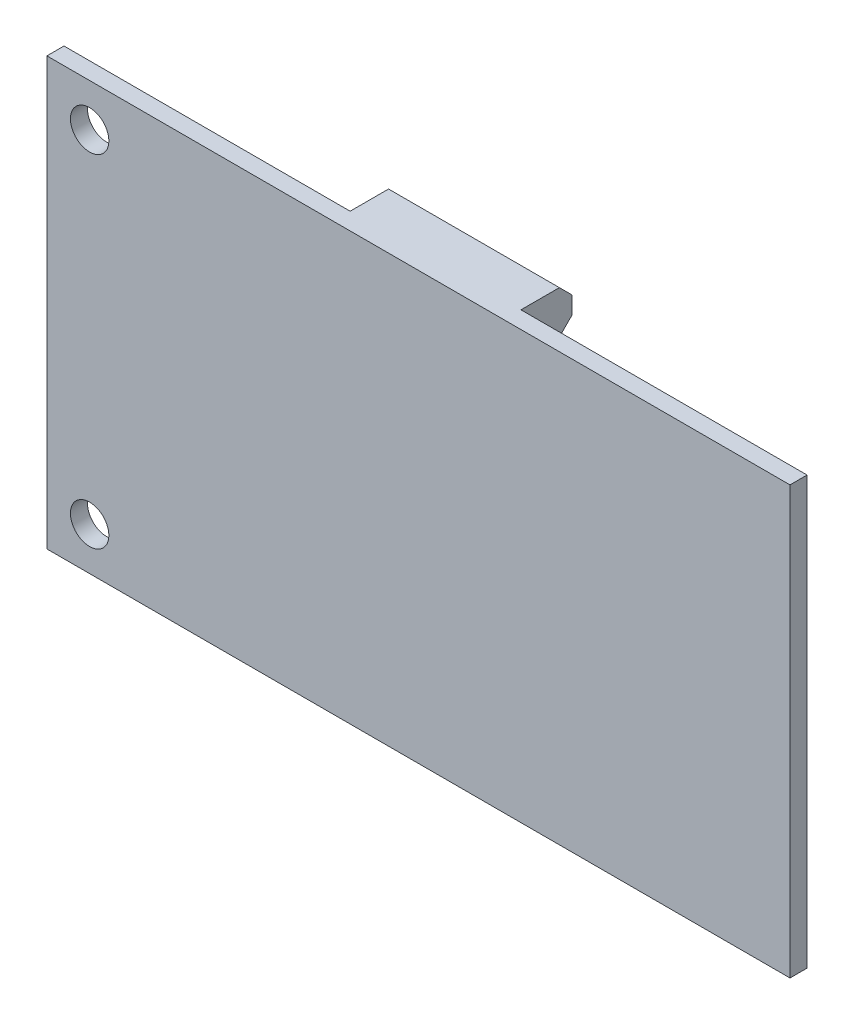
ISO-10303-21;
HEADER;
FILE_DESCRIPTION(('STEP AP214'),'2;1');
FILE_NAME('part.step','',(''),(''),'','','');
FILE_SCHEMA(('AUTOMOTIVE_DESIGN { 1 0 10303 214 1 1 1 1 }'));
ENDSEC;
DATA;
#1=APPLICATION_CONTEXT('core data for automotive mechanical design processes');
#2=APPLICATION_PROTOCOL_DEFINITION('international standard','automotive_design',2000,#1);
#3=PRODUCT_CONTEXT('',#1,'mechanical');
#4=PRODUCT('Part','Part','',(#3));
#5=PRODUCT_RELATED_PRODUCT_CATEGORY('part','',(#4));
#6=PRODUCT_DEFINITION_FORMATION('','',#4);
#7=PRODUCT_DEFINITION_CONTEXT('part definition',#1,'design');
#8=PRODUCT_DEFINITION('design','',#6,#7);
#9=PRODUCT_DEFINITION_SHAPE('','',#8);
#10=(LENGTH_UNIT() NAMED_UNIT(*) SI_UNIT(.MILLI.,.METRE.));
#11=(NAMED_UNIT(*) PLANE_ANGLE_UNIT() SI_UNIT($,.RADIAN.));
#12=(NAMED_UNIT(*) SI_UNIT($,.STERADIAN.) SOLID_ANGLE_UNIT());
#13=UNCERTAINTY_MEASURE_WITH_UNIT(LENGTH_MEASURE(1.E-05),#10,'distance_accuracy_value','');
#14=(GEOMETRIC_REPRESENTATION_CONTEXT(3) GLOBAL_UNCERTAINTY_ASSIGNED_CONTEXT((#13)) GLOBAL_UNIT_ASSIGNED_CONTEXT((#10,
#11,#12)) REPRESENTATION_CONTEXT('',''));
#15=CARTESIAN_POINT('',(0.,0.,0.));
#16=DIRECTION('',(0.,0.,1.));
#17=DIRECTION('',(1.,0.,0.));
#18=AXIS2_PLACEMENT_3D('',#15,#16,#17);
#19=CARTESIAN_POINT('',(0.,0.,0.));
#20=DIRECTION('',(0.,0.,1.));
#21=DIRECTION('',(1.,0.,0.));
#22=AXIS2_PLACEMENT_3D('',#19,#20,#21);
#23=PLANE('',#22);
#24=CARTESIAN_POINT('',(-38.5,20.,0.));
#25=DIRECTION('',(0.,0.,-1.));
#26=DIRECTION('',(-1.,0.,0.));
#27=AXIS2_PLACEMENT_3D('',#24,#25,#26);
#28=CIRCLE('',#27,2.25);
#29=CARTESIAN_POINT('',(-40.75,20.,0.));
#30=VERTEX_POINT('',#29);
#31=EDGE_CURVE('E425',#30,#30,#28,.T.);
#32=ORIENTED_EDGE('',*,*,#31,.F.);
#33=EDGE_LOOP('',(#32));
#34=FACE_BOUND('',#33,.T.);
#35=DIRECTION('',(0.,-1.,0.));
#36=VECTOR('',#35,1.);
#37=CARTESIAN_POINT('',(23.5,-25.,0.));
#38=LINE('',#37,#36);
#39=CARTESIAN_POINT('',(23.5,-22.5,0.));
#40=VERTEX_POINT('',#39);
#41=CARTESIAN_POINT('',(23.5,-25.,0.));
#42=VERTEX_POINT('',#41);
#43=EDGE_CURVE('E50',#40,#42,#38,.T.);
#44=ORIENTED_EDGE('',*,*,#43,.F.);
#45=DIRECTION('',(1.,0.,0.));
#46=VECTOR('',#45,1.);
#47=CARTESIAN_POINT('',(23.5,-22.5,0.));
#48=LINE('',#47,#46);
#49=CARTESIAN_POINT('',(16.5,-22.5,0.));
#50=VERTEX_POINT('',#49);
#51=EDGE_CURVE('E191',#50,#40,#48,.T.);
#52=ORIENTED_EDGE('',*,*,#51,.F.);
#53=DIRECTION('',(0.,1.,0.));
#54=VECTOR('',#53,1.);
#55=CARTESIAN_POINT('',(16.5,-25.,0.));
#56=LINE('',#55,#54);
#57=CARTESIAN_POINT('',(16.5,-25.,0.));
#58=VERTEX_POINT('',#57);
#59=EDGE_CURVE('E427',#58,#50,#56,.T.);
#60=ORIENTED_EDGE('',*,*,#59,.F.);
#61=DIRECTION('',(1.,0.,0.));
#62=VECTOR('',#61,1.);
#63=CARTESIAN_POINT('',(43.5,-25.,0.));
#64=LINE('',#63,#62);
#65=CARTESIAN_POINT('',(-10.,-25.,0.));
#66=VERTEX_POINT('',#65);
#67=EDGE_CURVE('E266',#66,#58,#64,.T.);
#68=ORIENTED_EDGE('',*,*,#67,.F.);
#69=DIRECTION('',(0.,-1.,0.));
#70=VECTOR('',#69,1.);
#71=CARTESIAN_POINT('',(-10.,-20.,0.));
#72=LINE('',#71,#70);
#73=CARTESIAN_POINT('',(-10.,-20.,0.));
#74=VERTEX_POINT('',#73);
#75=EDGE_CURVE('E209',#74,#66,#72,.T.);
#76=ORIENTED_EDGE('',*,*,#75,.F.);
#77=DIRECTION('',(-1.,0.,0.));
#78=VECTOR('',#77,1.);
#79=CARTESIAN_POINT('',(-10.,-20.,0.));
#80=LINE('',#79,#78);
#81=CARTESIAN_POINT('',(-20.,-20.,0.));
#82=VERTEX_POINT('',#81);
#83=EDGE_CURVE('E204',#74,#82,#80,.T.);
#84=ORIENTED_EDGE('',*,*,#83,.T.);
#85=DIRECTION('',(0.,-1.,0.));
#86=VECTOR('',#85,1.);
#87=CARTESIAN_POINT('',(-20.,-20.,0.));
#88=LINE('',#87,#86);
#89=CARTESIAN_POINT('',(-20.,-25.,0.));
#90=VERTEX_POINT('',#89);
#91=EDGE_CURVE('E218',#82,#90,#88,.T.);
#92=ORIENTED_EDGE('',*,*,#91,.T.);
#93=CARTESIAN_POINT('',(-43.5,-25.,0.));
#94=VERTEX_POINT('',#93);
#95=EDGE_CURVE('E262',#94,#90,#64,.T.);
#96=ORIENTED_EDGE('',*,*,#95,.F.);
#97=DIRECTION('',(0.,-1.,0.));
#98=VECTOR('',#97,1.);
#99=CARTESIAN_POINT('',(-43.5,-25.,0.));
#100=LINE('',#99,#98);
#101=CARTESIAN_POINT('',(-43.5,25.,0.));
#102=VERTEX_POINT('',#101);
#103=EDGE_CURVE('E239',#102,#94,#100,.T.);
#104=ORIENTED_EDGE('',*,*,#103,.F.);
#105=DIRECTION('',(-1.,0.,0.));
#106=VECTOR('',#105,1.);
#107=CARTESIAN_POINT('',(43.5,25.,0.));
#108=LINE('',#107,#106);
#109=CARTESIAN_POINT('',(-10.,25.,0.));
#110=VERTEX_POINT('',#109);
#111=EDGE_CURVE('E268',#110,#102,#108,.T.);
#112=ORIENTED_EDGE('',*,*,#111,.F.);
#113=DIRECTION('',(0.,1.,0.));
#114=VECTOR('',#113,1.);
#115=CARTESIAN_POINT('',(-10.,20.,0.));
#116=LINE('',#115,#114);
#117=CARTESIAN_POINT('',(-10.,20.,0.));
#118=VERTEX_POINT('',#117);
#119=EDGE_CURVE('E232',#118,#110,#116,.T.);
#120=ORIENTED_EDGE('',*,*,#119,.F.);
#121=DIRECTION('',(1.,0.,0.));
#122=VECTOR('',#121,1.);
#123=CARTESIAN_POINT('',(-10.,20.,0.));
#124=LINE('',#123,#122);
#125=CARTESIAN_POINT('',(10.,20.,0.));
#126=VERTEX_POINT('',#125);
#127=EDGE_CURVE('E225',#118,#126,#124,.T.);
#128=ORIENTED_EDGE('',*,*,#127,.T.);
#129=DIRECTION('',(0.,1.,0.));
#130=VECTOR('',#129,1.);
#131=CARTESIAN_POINT('',(10.,20.,0.));
#132=LINE('',#131,#130);
#133=CARTESIAN_POINT('',(9.99999999999999,25.,0.));
#134=VERTEX_POINT('',#133);
#135=EDGE_CURVE('E243',#126,#134,#132,.T.);
#136=ORIENTED_EDGE('',*,*,#135,.T.);
#137=CARTESIAN_POINT('',(43.5,25.,0.));
#138=VERTEX_POINT('',#137);
#139=EDGE_CURVE('E252',#138,#134,#108,.T.);
#140=ORIENTED_EDGE('',*,*,#139,.F.);
#141=DIRECTION('',(0.,1.,0.));
#142=VECTOR('',#141,1.);
#143=CARTESIAN_POINT('',(43.5,-25.,0.));
#144=LINE('',#143,#142);
#145=CARTESIAN_POINT('',(43.5,-25.,0.));
#146=VERTEX_POINT('',#145);
#147=EDGE_CURVE('E265',#146,#138,#144,.T.);
#148=ORIENTED_EDGE('',*,*,#147,.F.);
#149=EDGE_CURVE('E261',#42,#146,#64,.T.);
#150=ORIENTED_EDGE('',*,*,#149,.F.);
#151=EDGE_LOOP('',(#44,#52,#60,#68,#76,#84,#92,#96,#104,#112,#120,#128,#136,#140,#148,#150));
#152=FACE_BOUND('',#151,.T.);
#153=CARTESIAN_POINT('',(-38.5,-20.,0.));
#154=DIRECTION('',(0.,0.,-1.));
#155=DIRECTION('',(-1.,0.,0.));
#156=AXIS2_PLACEMENT_3D('',#153,#154,#155);
#157=CIRCLE('',#156,2.25);
#158=CARTESIAN_POINT('',(-40.75,-20.,0.));
#159=VERTEX_POINT('',#158);
#160=EDGE_CURVE('E582',#159,#159,#157,.T.);
#161=ORIENTED_EDGE('',*,*,#160,.F.);
#162=EDGE_LOOP('',(#161));
#163=FACE_BOUND('',#162,.T.);
#164=ADVANCED_FACE('F35',(#34,#152,#163),#23,.F.);
#165=CARTESIAN_POINT('',(-43.5,-25.,2.));
#166=DIRECTION('',(1.,0.,0.));
#167=DIRECTION('',(0.,0.,-1.));
#168=AXIS2_PLACEMENT_3D('',#165,#166,#167);
#169=PLANE('',#168);
#170=ORIENTED_EDGE('',*,*,#103,.T.);
#171=DIRECTION('',(0.,0.,-1.));
#172=VECTOR('',#171,1.);
#173=CARTESIAN_POINT('',(-43.5,-25.,2.));
#174=LINE('',#173,#172);
#175=CARTESIAN_POINT('',(-43.5,-25.,2.));
#176=VERTEX_POINT('',#175);
#177=EDGE_CURVE('E279',#176,#94,#174,.T.);
#178=ORIENTED_EDGE('',*,*,#177,.F.);
#179=DIRECTION('',(0.,-1.,0.));
#180=VECTOR('',#179,1.);
#181=CARTESIAN_POINT('',(-43.5,-25.,2.));
#182=LINE('',#181,#180);
#183=CARTESIAN_POINT('',(-43.5,25.,2.));
#184=VERTEX_POINT('',#183);
#185=EDGE_CURVE('E248',#184,#176,#182,.T.);
#186=ORIENTED_EDGE('',*,*,#185,.F.);
#187=DIRECTION('',(0.,0.,-1.));
#188=VECTOR('',#187,1.);
#189=CARTESIAN_POINT('',(-43.5,25.,2.));
#190=LINE('',#189,#188);
#191=EDGE_CURVE('E258',#184,#102,#190,.T.);
#192=ORIENTED_EDGE('',*,*,#191,.T.);
#193=EDGE_LOOP('',(#170,#178,#186,#192));
#194=FACE_BOUND('',#193,.T.);
#195=ADVANCED_FACE('F345',(#194),#169,.F.);
#196=CARTESIAN_POINT('',(43.5,-25.,2.));
#197=DIRECTION('',(0.,1.,0.));
#198=DIRECTION('',(-1.,0.,0.));
#199=AXIS2_PLACEMENT_3D('',#196,#197,#198);
#200=PLANE('',#199);
#201=DIRECTION('',(0.,0.,-1.));
#202=VECTOR('',#201,1.);
#203=CARTESIAN_POINT('',(-20.,-25.,0.));
#204=LINE('',#203,#202);
#205=CARTESIAN_POINT('',(-20.,-25.,-4.49999999999999));
#206=VERTEX_POINT('',#205);
#207=EDGE_CURVE('E196',#90,#206,#204,.T.);
#208=ORIENTED_EDGE('',*,*,#207,.T.);
#209=DIRECTION('',(1.,0.,0.));
#210=VECTOR('',#209,1.);
#211=CARTESIAN_POINT('',(-10.,-25.,-4.49999999999998));
#212=LINE('',#211,#210);
#213=CARTESIAN_POINT('',(-10.,-25.,-4.49999999999998));
#214=VERTEX_POINT('',#213);
#215=EDGE_CURVE('E11',#206,#214,#212,.T.);
#216=ORIENTED_EDGE('',*,*,#215,.T.);
#217=DIRECTION('',(0.,0.,1.));
#218=VECTOR('',#217,1.);
#219=CARTESIAN_POINT('',(-10.,-25.,0.));
#220=LINE('',#219,#218);
#221=EDGE_CURVE('E194',#214,#66,#220,.T.);
#222=ORIENTED_EDGE('',*,*,#221,.T.);
#223=ORIENTED_EDGE('',*,*,#67,.T.);
#224=DIRECTION('',(0.,0.,1.));
#225=VECTOR('',#224,1.);
#226=CARTESIAN_POINT('',(16.5,-25.,-6.));
#227=LINE('',#226,#225);
#228=CARTESIAN_POINT('',(16.5,-25.,-6.));
#229=VERTEX_POINT('',#228);
#230=EDGE_CURVE('E180',#229,#58,#227,.T.);
#231=ORIENTED_EDGE('',*,*,#230,.F.);
#232=DIRECTION('',(-1.,0.,0.));
#233=VECTOR('',#232,1.);
#234=CARTESIAN_POINT('',(23.5,-25.,-6.));
#235=LINE('',#234,#233);
#236=CARTESIAN_POINT('',(23.5,-25.,-6.));
#237=VERTEX_POINT('',#236);
#238=EDGE_CURVE('E174',#237,#229,#235,.T.);
#239=ORIENTED_EDGE('',*,*,#238,.F.);
#240=DIRECTION('',(0.,0.,1.));
#241=VECTOR('',#240,1.);
#242=CARTESIAN_POINT('',(23.5,-25.,-6.));
#243=LINE('',#242,#241);
#244=EDGE_CURVE('E177',#237,#42,#243,.T.);
#245=ORIENTED_EDGE('',*,*,#244,.T.);
#246=ORIENTED_EDGE('',*,*,#149,.T.);
#247=DIRECTION('',(0.,0.,-1.));
#248=VECTOR('',#247,1.);
#249=CARTESIAN_POINT('',(43.5,-25.,2.));
#250=LINE('',#249,#248);
#251=CARTESIAN_POINT('',(43.5,-25.,2.));
#252=VERTEX_POINT('',#251);
#253=EDGE_CURVE('E276',#252,#146,#250,.T.);
#254=ORIENTED_EDGE('',*,*,#253,.F.);
#255=DIRECTION('',(1.,0.,0.));
#256=VECTOR('',#255,1.);
#257=CARTESIAN_POINT('',(43.5,-25.,2.));
#258=LINE('',#257,#256);
#259=EDGE_CURVE('E251',#176,#252,#258,.T.);
#260=ORIENTED_EDGE('',*,*,#259,.F.);
#261=ORIENTED_EDGE('',*,*,#177,.T.);
#262=ORIENTED_EDGE('',*,*,#95,.T.);
#263=EDGE_LOOP('',(#208,#216,#222,#223,#231,#239,#245,#246,#254,#260,#261,#262));
#264=FACE_BOUND('',#263,.T.);
#265=ADVANCED_FACE('F176',(#264),#200,.F.);
#266=CARTESIAN_POINT('',(43.5,-25.,2.));
#267=DIRECTION('',(-1.,0.,0.));
#268=DIRECTION('',(0.,0.,1.));
#269=AXIS2_PLACEMENT_3D('',#266,#267,#268);
#270=PLANE('',#269);
#271=ORIENTED_EDGE('',*,*,#147,.T.);
#272=DIRECTION('',(0.,0.,-1.));
#273=VECTOR('',#272,1.);
#274=CARTESIAN_POINT('',(43.5,25.,2.));
#275=LINE('',#274,#273);
#276=CARTESIAN_POINT('',(43.5,25.,2.));
#277=VERTEX_POINT('',#276);
#278=EDGE_CURVE('E273',#277,#138,#275,.T.);
#279=ORIENTED_EDGE('',*,*,#278,.F.);
#280=DIRECTION('',(0.,1.,0.));
#281=VECTOR('',#280,1.);
#282=CARTESIAN_POINT('',(43.5,-25.,2.));
#283=LINE('',#282,#281);
#284=EDGE_CURVE('E254',#252,#277,#283,.T.);
#285=ORIENTED_EDGE('',*,*,#284,.F.);
#286=ORIENTED_EDGE('',*,*,#253,.T.);
#287=EDGE_LOOP('',(#271,#279,#285,#286));
#288=FACE_BOUND('',#287,.T.);
#289=ADVANCED_FACE('F361',(#288),#270,.F.);
#290=CARTESIAN_POINT('',(43.5,25.,2.));
#291=DIRECTION('',(0.,-1.,0.));
#292=DIRECTION('',(1.,0.,0.));
#293=AXIS2_PLACEMENT_3D('',#290,#291,#292);
#294=PLANE('',#293);
#295=DIRECTION('',(0.,0.,-1.));
#296=VECTOR('',#295,1.);
#297=CARTESIAN_POINT('',(10.,25.,0.));
#298=LINE('',#297,#296);
#299=CARTESIAN_POINT('',(10.,25.,-4.49999999999998));
#300=VERTEX_POINT('',#299);
#301=EDGE_CURVE('E226',#134,#300,#298,.T.);
#302=ORIENTED_EDGE('',*,*,#301,.T.);
#303=DIRECTION('',(-1.,0.,0.));
#304=VECTOR('',#303,1.);
#305=CARTESIAN_POINT('',(-10.,25.,-4.49999999999998));
#306=LINE('',#305,#304);
#307=CARTESIAN_POINT('',(-10.,25.,-4.49999999999998));
#308=VERTEX_POINT('',#307);
#309=EDGE_CURVE('E297',#300,#308,#306,.T.);
#310=ORIENTED_EDGE('',*,*,#309,.T.);
#311=DIRECTION('',(0.,0.,1.));
#312=VECTOR('',#311,1.);
#313=CARTESIAN_POINT('',(-10.,25.,0.));
#314=LINE('',#313,#312);
#315=EDGE_CURVE('E215',#308,#110,#314,.T.);
#316=ORIENTED_EDGE('',*,*,#315,.T.);
#317=ORIENTED_EDGE('',*,*,#111,.T.);
#318=ORIENTED_EDGE('',*,*,#191,.F.);
#319=DIRECTION('',(-1.,0.,0.));
#320=VECTOR('',#319,1.);
#321=CARTESIAN_POINT('',(43.5,25.,2.));
#322=LINE('',#321,#320);
#323=EDGE_CURVE('E256',#277,#184,#322,.T.);
#324=ORIENTED_EDGE('',*,*,#323,.F.);
#325=ORIENTED_EDGE('',*,*,#278,.T.);
#326=ORIENTED_EDGE('',*,*,#139,.T.);
#327=EDGE_LOOP('',(#302,#310,#316,#317,#318,#324,#325,#326));
#328=FACE_BOUND('',#327,.T.);
#329=ADVANCED_FACE('F358',(#328),#294,.F.);
#330=CARTESIAN_POINT('',(0.,0.,2.));
#331=DIRECTION('',(0.,0.,1.));
#332=DIRECTION('',(1.,0.,0.));
#333=AXIS2_PLACEMENT_3D('',#330,#331,#332);
#334=PLANE('',#333);
#335=CARTESIAN_POINT('',(-38.5,-20.,2.));
#336=DIRECTION('',(0.,0.,1.));
#337=DIRECTION('',(1.,0.,0.));
#338=AXIS2_PLACEMENT_3D('',#335,#336,#337);
#339=CIRCLE('',#338,2.25);
#340=CARTESIAN_POINT('',(-36.25,-20.,2.));
#341=VERTEX_POINT('',#340);
#342=EDGE_CURVE('E420',#341,#341,#339,.T.);
#343=ORIENTED_EDGE('',*,*,#342,.F.);
#344=EDGE_LOOP('',(#343));
#345=FACE_BOUND('',#344,.T.);
#346=CARTESIAN_POINT('',(-38.5,20.,2.));
#347=DIRECTION('',(0.,0.,1.));
#348=DIRECTION('',(1.,0.,0.));
#349=AXIS2_PLACEMENT_3D('',#346,#347,#348);
#350=CIRCLE('',#349,2.25);
#351=CARTESIAN_POINT('',(-36.25,20.,2.));
#352=VERTEX_POINT('',#351);
#353=EDGE_CURVE('E423',#352,#352,#350,.T.);
#354=ORIENTED_EDGE('',*,*,#353,.F.);
#355=EDGE_LOOP('',(#354));
#356=FACE_BOUND('',#355,.T.);
#357=ORIENTED_EDGE('',*,*,#185,.T.);
#358=ORIENTED_EDGE('',*,*,#259,.T.);
#359=ORIENTED_EDGE('',*,*,#284,.T.);
#360=ORIENTED_EDGE('',*,*,#323,.T.);
#361=EDGE_LOOP('',(#357,#358,#359,#360));
#362=FACE_BOUND('',#361,.T.);
#363=ADVANCED_FACE('F356',(#345,#356,#362),#334,.T.);
#364=CARTESIAN_POINT('',(-10.,20.,0.));
#365=DIRECTION('',(-1.,0.,0.));
#366=DIRECTION('',(0.,-1.,0.));
#367=AXIS2_PLACEMENT_3D('',#364,#365,#366);
#368=PLANE('',#367);
#369=DIRECTION('',(0.,1.,0.));
#370=VECTOR('',#369,1.);
#371=CARTESIAN_POINT('',(-10.,20.,-6.));
#372=LINE('',#371,#370);
#373=CARTESIAN_POINT('',(-10.,21.5,-6.));
#374=VERTEX_POINT('',#373);
#375=CARTESIAN_POINT('',(-10.,23.5,-6.));
#376=VERTEX_POINT('',#375);
#377=EDGE_CURVE('E236',#374,#376,#372,.T.);
#378=ORIENTED_EDGE('',*,*,#377,.F.);
#379=DIRECTION('',(0.,0.707106781186548,-0.707106781186548));
#380=VECTOR('',#379,1.);
#381=CARTESIAN_POINT('',(-10.,17.75,-2.25));
#382=LINE('',#381,#380);
#383=CARTESIAN_POINT('',(-10.,20.,-4.5));
#384=VERTEX_POINT('',#383);
#385=EDGE_CURVE('E289',#374,#384,#382,.F.);
#386=ORIENTED_EDGE('',*,*,#385,.T.);
#387=DIRECTION('',(0.,0.,1.));
#388=VECTOR('',#387,1.);
#389=CARTESIAN_POINT('',(-10.,20.,0.));
#390=LINE('',#389,#388);
#391=EDGE_CURVE('E223',#384,#118,#390,.T.);
#392=ORIENTED_EDGE('',*,*,#391,.T.);
#393=ORIENTED_EDGE('',*,*,#119,.T.);
#394=ORIENTED_EDGE('',*,*,#315,.F.);
#395=DIRECTION('',(0.,-0.707106781186547,-0.707106781186548));
#396=VECTOR('',#395,1.);
#397=CARTESIAN_POINT('',(-10.,24.75,-4.74999999999999));
#398=LINE('',#397,#396);
#399=EDGE_CURVE('E287',#308,#376,#398,.T.);
#400=ORIENTED_EDGE('',*,*,#399,.T.);
#401=EDGE_LOOP('',(#378,#386,#392,#393,#394,#400));
#402=FACE_BOUND('',#401,.T.);
#403=ADVANCED_FACE('F403',(#402),#368,.T.);
#404=CARTESIAN_POINT('',(-10.,20.,-6.));
#405=DIRECTION('',(0.,0.,-1.));
#406=DIRECTION('',(-1.,0.,0.));
#407=AXIS2_PLACEMENT_3D('',#404,#405,#406);
#408=PLANE('',#407);
#409=DIRECTION('',(0.,1.,0.));
#410=VECTOR('',#409,1.);
#411=CARTESIAN_POINT('',(10.,20.,-6.));
#412=LINE('',#411,#410);
#413=CARTESIAN_POINT('',(10.,21.5,-6.));
#414=VERTEX_POINT('',#413);
#415=CARTESIAN_POINT('',(10.,23.5,-6.));
#416=VERTEX_POINT('',#415);
#417=EDGE_CURVE('E240',#414,#416,#412,.T.);
#418=ORIENTED_EDGE('',*,*,#417,.F.);
#419=DIRECTION('',(-1.,0.,0.));
#420=VECTOR('',#419,1.);
#421=CARTESIAN_POINT('',(-10.,21.5,-6.));
#422=LINE('',#421,#420);
#423=EDGE_CURVE('E284',#414,#374,#422,.T.);
#424=ORIENTED_EDGE('',*,*,#423,.T.);
#425=ORIENTED_EDGE('',*,*,#377,.T.);
#426=DIRECTION('',(1.,0.,0.));
#427=VECTOR('',#426,1.);
#428=CARTESIAN_POINT('',(10.,23.5,-6.));
#429=LINE('',#428,#427);
#430=EDGE_CURVE('E282',#376,#416,#429,.T.);
#431=ORIENTED_EDGE('',*,*,#430,.T.);
#432=EDGE_LOOP('',(#418,#424,#425,#431));
#433=FACE_BOUND('',#432,.T.);
#434=ADVANCED_FACE('F400',(#433),#408,.T.);
#435=CARTESIAN_POINT('',(10.,20.,0.));
#436=DIRECTION('',(1.,0.,0.));
#437=DIRECTION('',(0.,0.,-1.));
#438=AXIS2_PLACEMENT_3D('',#435,#436,#437);
#439=PLANE('',#438);
#440=DIRECTION('',(0.,0.,-1.));
#441=VECTOR('',#440,1.);
#442=CARTESIAN_POINT('',(10.,20.,0.));
#443=LINE('',#442,#441);
#444=CARTESIAN_POINT('',(10.,20.,-4.5));
#445=VERTEX_POINT('',#444);
#446=EDGE_CURVE('E229',#126,#445,#443,.T.);
#447=ORIENTED_EDGE('',*,*,#446,.T.);
#448=DIRECTION('',(0.,-0.707106781186548,0.707106781186548));
#449=VECTOR('',#448,1.);
#450=CARTESIAN_POINT('',(10.,17.75,-2.25));
#451=LINE('',#450,#449);
#452=EDGE_CURVE('E295',#445,#414,#451,.F.);
#453=ORIENTED_EDGE('',*,*,#452,.T.);
#454=ORIENTED_EDGE('',*,*,#417,.T.);
#455=DIRECTION('',(0.,0.707106781186547,0.707106781186548));
#456=VECTOR('',#455,1.);
#457=CARTESIAN_POINT('',(10.,24.75,-4.74999999999999));
#458=LINE('',#457,#456);
#459=EDGE_CURVE('E293',#416,#300,#458,.T.);
#460=ORIENTED_EDGE('',*,*,#459,.T.);
#461=ORIENTED_EDGE('',*,*,#301,.F.);
#462=ORIENTED_EDGE('',*,*,#135,.F.);
#463=EDGE_LOOP('',(#447,#453,#454,#460,#461,#462));
#464=FACE_BOUND('',#463,.T.);
#465=ADVANCED_FACE('F384',(#464),#439,.T.);
#466=CARTESIAN_POINT('',(0.,20.,0.));
#467=DIRECTION('',(0.,-1.,0.));
#468=DIRECTION('',(0.,0.,-1.));
#469=AXIS2_PLACEMENT_3D('',#466,#467,#468);
#470=PLANE('',#469);
#471=ORIENTED_EDGE('',*,*,#391,.F.);
#472=DIRECTION('',(1.,0.,0.));
#473=VECTOR('',#472,1.);
#474=CARTESIAN_POINT('',(0.,20.,-4.5));
#475=LINE('',#474,#473);
#476=EDGE_CURVE('E291',#384,#445,#475,.T.);
#477=ORIENTED_EDGE('',*,*,#476,.T.);
#478=ORIENTED_EDGE('',*,*,#446,.F.);
#479=ORIENTED_EDGE('',*,*,#127,.F.);
#480=EDGE_LOOP('',(#471,#477,#478,#479));
#481=FACE_BOUND('',#480,.T.);
#482=ADVANCED_FACE('F372',(#481),#470,.T.);
#483=CARTESIAN_POINT('',(-10.,21.5,-6.));
#484=DIRECTION('',(0.,0.707106781186547,0.707106781186547));
#485=DIRECTION('',(-1.,0.,0.));
#486=AXIS2_PLACEMENT_3D('',#483,#484,#485);
#487=PLANE('',#486);
#488=ORIENTED_EDGE('',*,*,#452,.F.);
#489=ORIENTED_EDGE('',*,*,#476,.F.);
#490=ORIENTED_EDGE('',*,*,#385,.F.);
#491=ORIENTED_EDGE('',*,*,#423,.F.);
#492=EDGE_LOOP('',(#488,#489,#490,#491));
#493=FACE_BOUND('',#492,.T.);
#494=ADVANCED_FACE('F368',(#493),#487,.F.);
#495=CARTESIAN_POINT('',(43.5,25.,-4.49999999999998));
#496=DIRECTION('',(0.,0.707106781186548,-0.707106781186547));
#497=DIRECTION('',(1.,0.,0.));
#498=AXIS2_PLACEMENT_3D('',#495,#496,#497);
#499=PLANE('',#498);
#500=ORIENTED_EDGE('',*,*,#459,.F.);
#501=ORIENTED_EDGE('',*,*,#430,.F.);
#502=ORIENTED_EDGE('',*,*,#399,.F.);
#503=ORIENTED_EDGE('',*,*,#309,.F.);
#504=EDGE_LOOP('',(#500,#501,#502,#503));
#505=FACE_BOUND('',#504,.T.);
#506=ADVANCED_FACE('F371',(#505),#499,.T.);
#507=CARTESIAN_POINT('',(-10.,-20.,0.));
#508=DIRECTION('',(1.,0.,0.));
#509=DIRECTION('',(0.,0.,-1.));
#510=AXIS2_PLACEMENT_3D('',#507,#508,#509);
#511=PLANE('',#510);
#512=DIRECTION('',(0.,-1.,0.));
#513=VECTOR('',#512,1.);
#514=CARTESIAN_POINT('',(-10.,-20.,-6.));
#515=LINE('',#514,#513);
#516=CARTESIAN_POINT('',(-10.,-21.5,-6.));
#517=VERTEX_POINT('',#516);
#518=CARTESIAN_POINT('',(-10.,-23.5,-6.));
#519=VERTEX_POINT('',#518);
#520=EDGE_CURVE('E212',#517,#519,#515,.T.);
#521=ORIENTED_EDGE('',*,*,#520,.F.);
#522=DIRECTION('',(0.,-0.707106781186544,-0.707106781186551));
#523=VECTOR('',#522,1.);
#524=CARTESIAN_POINT('',(-10.,-17.75,-2.24999999999998));
#525=LINE('',#524,#523);
#526=CARTESIAN_POINT('',(-10.,-20.,-4.5));
#527=VERTEX_POINT('',#526);
#528=EDGE_CURVE('E307',#517,#527,#525,.F.);
#529=ORIENTED_EDGE('',*,*,#528,.T.);
#530=DIRECTION('',(0.,0.,1.));
#531=VECTOR('',#530,1.);
#532=CARTESIAN_POINT('',(-10.,-20.,0.));
#533=LINE('',#532,#531);
#534=EDGE_CURVE('E202',#527,#74,#533,.T.);
#535=ORIENTED_EDGE('',*,*,#534,.T.);
#536=ORIENTED_EDGE('',*,*,#75,.T.);
#537=ORIENTED_EDGE('',*,*,#221,.F.);
#538=DIRECTION('',(0.,0.707106781186548,-0.707106781186548));
#539=VECTOR('',#538,1.);
#540=CARTESIAN_POINT('',(-10.,-24.75,-4.74999999999999));
#541=LINE('',#540,#539);
#542=EDGE_CURVE('E305',#214,#519,#541,.T.);
#543=ORIENTED_EDGE('',*,*,#542,.T.);
#544=EDGE_LOOP('',(#521,#529,#535,#536,#537,#543));
#545=FACE_BOUND('',#544,.T.);
#546=ADVANCED_FACE('F325',(#545),#511,.T.);
#547=CARTESIAN_POINT('',(-10.,-20.,-6.));
#548=DIRECTION('',(0.,0.,-1.));
#549=DIRECTION('',(-1.,0.,0.));
#550=AXIS2_PLACEMENT_3D('',#547,#548,#549);
#551=PLANE('',#550);
#552=DIRECTION('',(0.,-1.,0.));
#553=VECTOR('',#552,1.);
#554=CARTESIAN_POINT('',(-20.,-20.,-6.));
#555=LINE('',#554,#553);
#556=CARTESIAN_POINT('',(-20.,-21.5,-6.));
#557=VERTEX_POINT('',#556);
#558=CARTESIAN_POINT('',(-20.,-23.5,-6.));
#559=VERTEX_POINT('',#558);
#560=EDGE_CURVE('E216',#557,#559,#555,.T.);
#561=ORIENTED_EDGE('',*,*,#560,.F.);
#562=DIRECTION('',(1.,0.,0.));
#563=VECTOR('',#562,1.);
#564=CARTESIAN_POINT('',(-10.,-21.5,-6.));
#565=LINE('',#564,#563);
#566=EDGE_CURVE('E302',#557,#517,#565,.T.);
#567=ORIENTED_EDGE('',*,*,#566,.T.);
#568=ORIENTED_EDGE('',*,*,#520,.T.);
#569=DIRECTION('',(-1.,0.,0.));
#570=VECTOR('',#569,1.);
#571=CARTESIAN_POINT('',(-20.,-23.5,-6.));
#572=LINE('',#571,#570);
#573=EDGE_CURVE('E300',#519,#559,#572,.T.);
#574=ORIENTED_EDGE('',*,*,#573,.T.);
#575=EDGE_LOOP('',(#561,#567,#568,#574));
#576=FACE_BOUND('',#575,.T.);
#577=ADVANCED_FACE('F319',(#576),#551,.T.);
#578=CARTESIAN_POINT('',(-20.,-20.,0.));
#579=DIRECTION('',(-1.,0.,0.));
#580=DIRECTION('',(0.,-1.,0.));
#581=AXIS2_PLACEMENT_3D('',#578,#579,#580);
#582=PLANE('',#581);
#583=DIRECTION('',(0.,0.,-1.));
#584=VECTOR('',#583,1.);
#585=CARTESIAN_POINT('',(-20.,-20.,0.));
#586=LINE('',#585,#584);
#587=CARTESIAN_POINT('',(-20.,-20.,-4.5));
#588=VERTEX_POINT('',#587);
#589=EDGE_CURVE('E207',#82,#588,#586,.T.);
#590=ORIENTED_EDGE('',*,*,#589,.T.);
#591=DIRECTION('',(0.,0.707106781186544,0.707106781186551));
#592=VECTOR('',#591,1.);
#593=CARTESIAN_POINT('',(-20.,-17.75,-2.24999999999998));
#594=LINE('',#593,#592);
#595=EDGE_CURVE('E43',#588,#557,#594,.F.);
#596=ORIENTED_EDGE('',*,*,#595,.T.);
#597=ORIENTED_EDGE('',*,*,#560,.T.);
#598=DIRECTION('',(0.,-0.707106781186548,0.707106781186548));
#599=VECTOR('',#598,1.);
#600=CARTESIAN_POINT('',(-20.,-24.75,-4.74999999999999));
#601=LINE('',#600,#599);
#602=EDGE_CURVE('E58',#559,#206,#601,.T.);
#603=ORIENTED_EDGE('',*,*,#602,.T.);
#604=ORIENTED_EDGE('',*,*,#207,.F.);
#605=ORIENTED_EDGE('',*,*,#91,.F.);
#606=EDGE_LOOP('',(#590,#596,#597,#603,#604,#605));
#607=FACE_BOUND('',#606,.T.);
#608=ADVANCED_FACE('F313',(#607),#582,.T.);
#609=CARTESIAN_POINT('',(0.,-20.,0.));
#610=DIRECTION('',(0.,1.,0.));
#611=DIRECTION('',(-1.,0.,0.));
#612=AXIS2_PLACEMENT_3D('',#609,#610,#611);
#613=PLANE('',#612);
#614=ORIENTED_EDGE('',*,*,#534,.F.);
#615=DIRECTION('',(-1.,0.,0.));
#616=VECTOR('',#615,1.);
#617=CARTESIAN_POINT('',(0.,-20.,-4.49999999999999));
#618=LINE('',#617,#616);
#619=EDGE_CURVE('E309',#527,#588,#618,.T.);
#620=ORIENTED_EDGE('',*,*,#619,.T.);
#621=ORIENTED_EDGE('',*,*,#589,.F.);
#622=ORIENTED_EDGE('',*,*,#83,.F.);
#623=EDGE_LOOP('',(#614,#620,#621,#622));
#624=FACE_BOUND('',#623,.T.);
#625=ADVANCED_FACE('F328',(#624),#613,.T.);
#626=CARTESIAN_POINT('',(-10.,-21.5,-6.));
#627=DIRECTION('',(0.,-0.707106781186551,0.707106781186544));
#628=DIRECTION('',(1.,0.,0.));
#629=AXIS2_PLACEMENT_3D('',#626,#627,#628);
#630=PLANE('',#629);
#631=ORIENTED_EDGE('',*,*,#595,.F.);
#632=ORIENTED_EDGE('',*,*,#619,.F.);
#633=ORIENTED_EDGE('',*,*,#528,.F.);
#634=ORIENTED_EDGE('',*,*,#566,.F.);
#635=EDGE_LOOP('',(#631,#632,#633,#634));
#636=FACE_BOUND('',#635,.T.);
#637=ADVANCED_FACE('F322',(#636),#630,.F.);
#638=CARTESIAN_POINT('',(43.5,-25.,-4.49999999999996));
#639=DIRECTION('',(0.,-0.707106781186547,-0.707106781186547));
#640=DIRECTION('',(-1.,0.,0.));
#641=AXIS2_PLACEMENT_3D('',#638,#639,#640);
#642=PLANE('',#641);
#643=ORIENTED_EDGE('',*,*,#602,.F.);
#644=ORIENTED_EDGE('',*,*,#573,.F.);
#645=ORIENTED_EDGE('',*,*,#542,.F.);
#646=ORIENTED_EDGE('',*,*,#215,.F.);
#647=EDGE_LOOP('',(#643,#644,#645,#646));
#648=FACE_BOUND('',#647,.T.);
#649=ADVANCED_FACE('F37',(#648),#642,.T.);
#650=CARTESIAN_POINT('',(23.5,-25.,-6.));
#651=DIRECTION('',(-1.,0.,0.));
#652=DIRECTION('',(0.,-1.,0.));
#653=AXIS2_PLACEMENT_3D('',#650,#651,#652);
#654=PLANE('',#653);
#655=ORIENTED_EDGE('',*,*,#43,.T.);
#656=ORIENTED_EDGE('',*,*,#244,.F.);
#657=DIRECTION('',(0.,-1.,0.));
#658=VECTOR('',#657,1.);
#659=CARTESIAN_POINT('',(23.5,-25.,-6.));
#660=LINE('',#659,#658);
#661=CARTESIAN_POINT('',(23.5,-22.5,-6.));
#662=VERTEX_POINT('',#661);
#663=EDGE_CURVE('E184',#662,#237,#660,.T.);
#664=ORIENTED_EDGE('',*,*,#663,.F.);
#665=DIRECTION('',(0.,0.,1.));
#666=VECTOR('',#665,1.);
#667=CARTESIAN_POINT('',(23.5,-22.5,-6.));
#668=LINE('',#667,#666);
#669=EDGE_CURVE('E434',#662,#40,#668,.T.);
#670=ORIENTED_EDGE('',*,*,#669,.T.);
#671=EDGE_LOOP('',(#655,#656,#664,#670));
#672=FACE_BOUND('',#671,.T.);
#673=ADVANCED_FACE('F193',(#672),#654,.F.);
#674=CARTESIAN_POINT('',(16.5,-25.,-6.));
#675=DIRECTION('',(1.,0.,0.));
#676=DIRECTION('',(0.,0.,-1.));
#677=AXIS2_PLACEMENT_3D('',#674,#675,#676);
#678=PLANE('',#677);
#679=ORIENTED_EDGE('',*,*,#59,.T.);
#680=DIRECTION('',(0.,0.,1.));
#681=VECTOR('',#680,1.);
#682=CARTESIAN_POINT('',(16.5,-22.5,-6.));
#683=LINE('',#682,#681);
#684=CARTESIAN_POINT('',(16.5,-22.5,-6.));
#685=VERTEX_POINT('',#684);
#686=EDGE_CURVE('E198',#685,#50,#683,.T.);
#687=ORIENTED_EDGE('',*,*,#686,.F.);
#688=DIRECTION('',(0.,1.,0.));
#689=VECTOR('',#688,1.);
#690=CARTESIAN_POINT('',(16.5,-25.,-6.));
#691=LINE('',#690,#689);
#692=EDGE_CURVE('E183',#229,#685,#691,.T.);
#693=ORIENTED_EDGE('',*,*,#692,.F.);
#694=ORIENTED_EDGE('',*,*,#230,.T.);
#695=EDGE_LOOP('',(#679,#687,#693,#694));
#696=FACE_BOUND('',#695,.T.);
#697=ADVANCED_FACE('F342',(#696),#678,.F.);
#698=CARTESIAN_POINT('',(23.5,-22.5,-6.));
#699=DIRECTION('',(0.,-1.,0.));
#700=DIRECTION('',(0.,0.,-1.));
#701=AXIS2_PLACEMENT_3D('',#698,#699,#700);
#702=PLANE('',#701);
#703=ORIENTED_EDGE('',*,*,#51,.T.);
#704=ORIENTED_EDGE('',*,*,#669,.F.);
#705=DIRECTION('',(1.,0.,0.));
#706=VECTOR('',#705,1.);
#707=CARTESIAN_POINT('',(23.5,-22.5,-6.));
#708=LINE('',#707,#706);
#709=EDGE_CURVE('E189',#685,#662,#708,.T.);
#710=ORIENTED_EDGE('',*,*,#709,.F.);
#711=ORIENTED_EDGE('',*,*,#686,.T.);
#712=EDGE_LOOP('',(#703,#704,#710,#711));
#713=FACE_BOUND('',#712,.T.);
#714=ADVANCED_FACE('F442',(#713),#702,.F.);
#715=CARTESIAN_POINT('',(0.,0.,-6.));
#716=DIRECTION('',(0.,0.,1.));
#717=DIRECTION('',(1.,0.,0.));
#718=AXIS2_PLACEMENT_3D('',#715,#716,#717);
#719=PLANE('',#718);
#720=ORIENTED_EDGE('',*,*,#663,.T.);
#721=ORIENTED_EDGE('',*,*,#238,.T.);
#722=ORIENTED_EDGE('',*,*,#692,.T.);
#723=ORIENTED_EDGE('',*,*,#709,.T.);
#724=EDGE_LOOP('',(#720,#721,#722,#723));
#725=FACE_BOUND('',#724,.T.);
#726=ADVANCED_FACE('F187',(#725),#719,.F.);
#727=CARTESIAN_POINT('',(-38.5,20.,0.));
#728=DIRECTION('',(0.,0.,-1.));
#729=DIRECTION('',(-1.,0.,0.));
#730=AXIS2_PLACEMENT_3D('',#727,#728,#729);
#731=CYLINDRICAL_SURFACE('',#730,2.25);
#732=ORIENTED_EDGE('',*,*,#31,.T.);
#733=EDGE_LOOP('',(#732));
#734=FACE_BOUND('',#733,.T.);
#735=ORIENTED_EDGE('',*,*,#353,.T.);
#736=EDGE_LOOP('',(#735));
#737=FACE_BOUND('',#736,.T.);
#738=ADVANCED_FACE('F546',(#734,#737),#731,.F.);
#739=CARTESIAN_POINT('',(-38.5,-20.,0.));
#740=DIRECTION('',(0.,0.,-1.));
#741=DIRECTION('',(-1.,0.,0.));
#742=AXIS2_PLACEMENT_3D('',#739,#740,#741);
#743=CYLINDRICAL_SURFACE('',#742,2.25);
#744=ORIENTED_EDGE('',*,*,#160,.T.);
#745=EDGE_LOOP('',(#744));
#746=FACE_BOUND('',#745,.T.);
#747=ORIENTED_EDGE('',*,*,#342,.T.);
#748=EDGE_LOOP('',(#747));
#749=FACE_BOUND('',#748,.T.);
#750=ADVANCED_FACE('F565',(#746,#749),#743,.F.);
#751=CLOSED_SHELL('',(#164,#195,#265,#289,#329,#363,#403,#434,#465,#482,#494,#506,#546,#577,
#608,#625,#637,#649,#673,#697,#714,#726,#738,#750));
#752=MANIFOLD_SOLID_BREP('B2',#751);
#753=ADVANCED_BREP_SHAPE_REPRESENTATION('',(#18,#752),#14);
#754=SHAPE_DEFINITION_REPRESENTATION(#9,#753);
ENDSEC;
END-ISO-10303-21;
